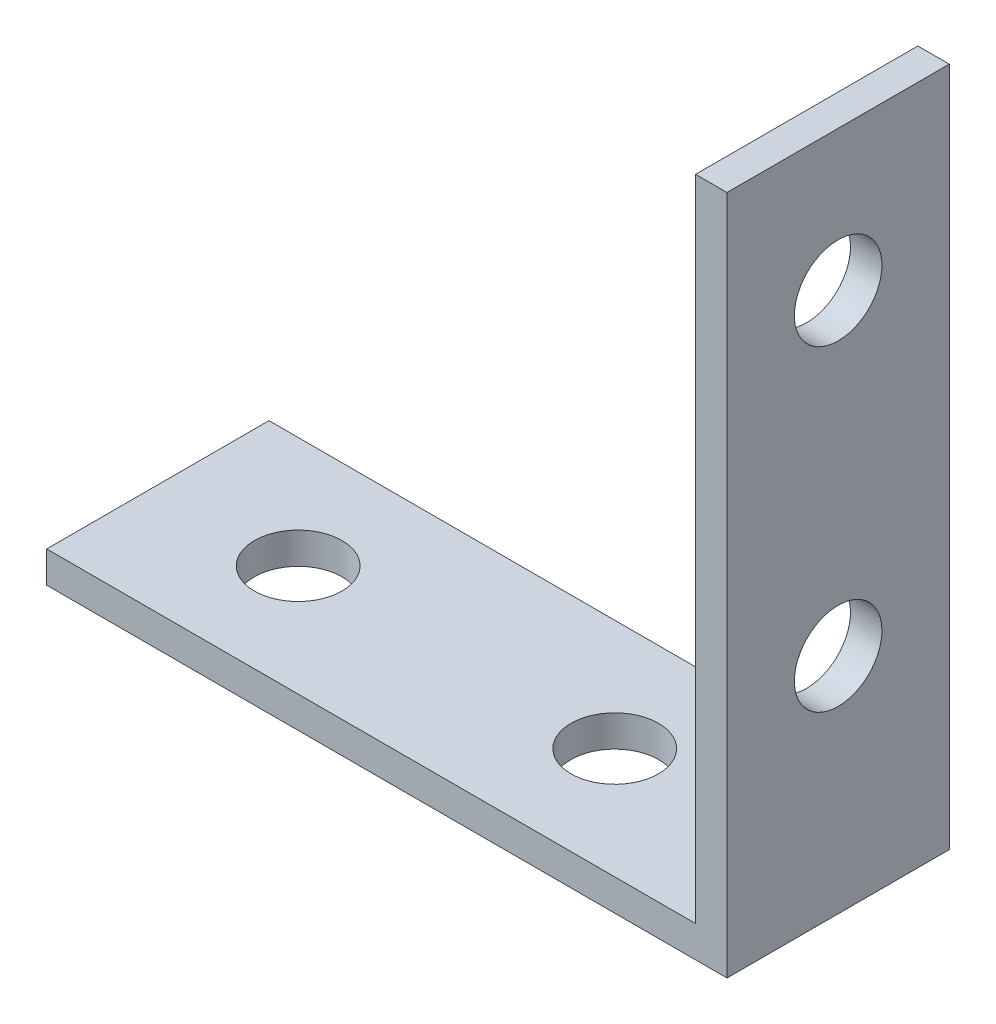
ISO-10303-21;
HEADER;
FILE_DESCRIPTION(('STEP AP214'),'2;1');
FILE_NAME('part.step','',(''),(''),'','','');
FILE_SCHEMA(('AUTOMOTIVE_DESIGN { 1 0 10303 214 1 1 1 1 }'));
ENDSEC;
DATA;
#1=APPLICATION_CONTEXT('core data for automotive mechanical design processes');
#2=APPLICATION_PROTOCOL_DEFINITION('international standard','automotive_design',2000,#1);
#3=PRODUCT_CONTEXT('',#1,'mechanical');
#4=PRODUCT('Part','Part','',(#3));
#5=PRODUCT_RELATED_PRODUCT_CATEGORY('part','',(#4));
#6=PRODUCT_DEFINITION_FORMATION('','',#4);
#7=PRODUCT_DEFINITION_CONTEXT('part definition',#1,'design');
#8=PRODUCT_DEFINITION('design','',#6,#7);
#9=PRODUCT_DEFINITION_SHAPE('','',#8);
#10=(LENGTH_UNIT() NAMED_UNIT(*) SI_UNIT(.MILLI.,.METRE.));
#11=(NAMED_UNIT(*) PLANE_ANGLE_UNIT() SI_UNIT($,.RADIAN.));
#12=(NAMED_UNIT(*) SI_UNIT($,.STERADIAN.) SOLID_ANGLE_UNIT());
#13=UNCERTAINTY_MEASURE_WITH_UNIT(LENGTH_MEASURE(1.E-05),#10,'distance_accuracy_value','');
#14=(GEOMETRIC_REPRESENTATION_CONTEXT(3) GLOBAL_UNCERTAINTY_ASSIGNED_CONTEXT((#13)) GLOBAL_UNIT_ASSIGNED_CONTEXT((#10,
#11,#12)) REPRESENTATION_CONTEXT('',''));
#15=CARTESIAN_POINT('',(0.,0.,0.));
#16=DIRECTION('',(0.,0.,1.));
#17=DIRECTION('',(1.,0.,0.));
#18=AXIS2_PLACEMENT_3D('',#15,#16,#17);
#19=CARTESIAN_POINT('',(0.,0.,12.573));
#20=DIRECTION('',(1.,0.,0.));
#21=DIRECTION('',(0.,0.,-1.));
#22=AXIS2_PLACEMENT_3D('',#19,#20,#21);
#23=PLANE('',#22);
#24=DIRECTION('',(0.,-1.,0.));
#25=VECTOR('',#24,1.);
#26=CARTESIAN_POINT('',(0.,0.,12.573));
#27=LINE('',#26,#25);
#28=CARTESIAN_POINT('',(0.,1.778,12.573));
#29=VERTEX_POINT('',#28);
#30=CARTESIAN_POINT('',(0.,0.,12.573));
#31=VERTEX_POINT('',#30);
#32=EDGE_CURVE('E77',#29,#31,#27,.T.);
#33=ORIENTED_EDGE('',*,*,#32,.F.);
#34=DIRECTION('',(0.,0.,1.));
#35=VECTOR('',#34,1.);
#36=CARTESIAN_POINT('',(0.,1.778,0.));
#37=LINE('',#36,#35);
#38=CARTESIAN_POINT('',(0.,1.778,0.));
#39=VERTEX_POINT('',#38);
#40=EDGE_CURVE('E97',#39,#29,#37,.T.);
#41=ORIENTED_EDGE('',*,*,#40,.F.);
#42=DIRECTION('',(0.,-1.,0.));
#43=VECTOR('',#42,1.);
#44=CARTESIAN_POINT('',(0.,0.,0.));
#45=LINE('',#44,#43);
#46=CARTESIAN_POINT('',(0.,0.,0.));
#47=VERTEX_POINT('',#46);
#48=EDGE_CURVE('E105',#39,#47,#45,.T.);
#49=ORIENTED_EDGE('',*,*,#48,.T.);
#50=DIRECTION('',(0.,0.,-1.));
#51=VECTOR('',#50,1.);
#52=CARTESIAN_POINT('',(0.,0.,12.573));
#53=LINE('',#52,#51);
#54=EDGE_CURVE('E11',#31,#47,#53,.T.);
#55=ORIENTED_EDGE('',*,*,#54,.F.);
#56=EDGE_LOOP('',(#33,#41,#49,#55));
#57=FACE_BOUND('',#56,.T.);
#58=ADVANCED_FACE('F32',(#57),#23,.F.);
#59=CARTESIAN_POINT('',(0.,0.,12.573));
#60=DIRECTION('',(0.,1.,0.));
#61=DIRECTION('',(0.,0.,1.));
#62=AXIS2_PLACEMENT_3D('',#59,#60,#61);
#63=PLANE('',#62);
#64=CARTESIAN_POINT('',(7.93750000000004,-7.42244807283576E-13,6.2865));
#65=DIRECTION('',(0.,-1.,0.));
#66=DIRECTION('',(1.,0.,0.));
#67=AXIS2_PLACEMENT_3D('',#64,#65,#66);
#68=CIRCLE('',#67,2.4765);
#69=CARTESIAN_POINT('',(10.414,-6.82227164254232E-13,6.2865));
#70=VERTEX_POINT('',#69);
#71=EDGE_CURVE('E157',#70,#70,#68,.T.);
#72=ORIENTED_EDGE('',*,*,#71,.F.);
#73=EDGE_LOOP('',(#72));
#74=FACE_BOUND('',#73,.T.);
#75=CARTESIAN_POINT('',(25.8445,-3.05094491337421E-13,6.2865));
#76=DIRECTION('',(0.,-1.,0.));
#77=DIRECTION('',(1.,0.,0.));
#78=AXIS2_PLACEMENT_3D('',#75,#76,#77);
#79=CIRCLE('',#78,2.4765);
#80=CARTESIAN_POINT('',(28.321,-2.45076848308077E-13,6.2865));
#81=VERTEX_POINT('',#80);
#82=EDGE_CURVE('E151',#81,#81,#79,.T.);
#83=ORIENTED_EDGE('',*,*,#82,.F.);
#84=EDGE_LOOP('',(#83));
#85=FACE_BOUND('',#84,.T.);
#86=DIRECTION('',(1.,0.,0.));
#87=VECTOR('',#86,1.);
#88=CARTESIAN_POINT('',(0.,0.,0.));
#89=LINE('',#88,#87);
#90=CARTESIAN_POINT('',(38.481,0.,0.));
#91=VERTEX_POINT('',#90);
#92=EDGE_CURVE('E109',#47,#91,#89,.T.);
#93=ORIENTED_EDGE('',*,*,#92,.T.);
#94=DIRECTION('',(0.,0.,-1.));
#95=VECTOR('',#94,1.);
#96=CARTESIAN_POINT('',(38.481,0.,12.573));
#97=LINE('',#96,#95);
#98=CARTESIAN_POINT('',(38.481,0.,12.573));
#99=VERTEX_POINT('',#98);
#100=EDGE_CURVE('E39',#99,#91,#97,.T.);
#101=ORIENTED_EDGE('',*,*,#100,.F.);
#102=DIRECTION('',(1.,0.,0.));
#103=VECTOR('',#102,1.);
#104=CARTESIAN_POINT('',(0.,0.,12.573));
#105=LINE('',#104,#103);
#106=EDGE_CURVE('E132',#31,#99,#105,.T.);
#107=ORIENTED_EDGE('',*,*,#106,.F.);
#108=ORIENTED_EDGE('',*,*,#54,.T.);
#109=EDGE_LOOP('',(#93,#101,#107,#108));
#110=FACE_BOUND('',#109,.T.);
#111=ADVANCED_FACE('F169',(#74,#85,#110),#63,.F.);
#112=CARTESIAN_POINT('',(38.481,0.,12.573));
#113=DIRECTION('',(-1.,0.,0.));
#114=DIRECTION('',(0.,0.,1.));
#115=AXIS2_PLACEMENT_3D('',#112,#113,#114);
#116=PLANE('',#115);
#117=CARTESIAN_POINT('',(38.481,30.5435,6.2865));
#118=DIRECTION('',(-1.,0.,0.));
#119=DIRECTION('',(0.,-1.,0.));
#120=AXIS2_PLACEMENT_3D('',#117,#118,#119);
#121=CIRCLE('',#120,2.4765);
#122=CARTESIAN_POINT('',(38.481,28.067,6.2865));
#123=VERTEX_POINT('',#122);
#124=EDGE_CURVE('E145',#123,#123,#121,.T.);
#125=ORIENTED_EDGE('',*,*,#124,.T.);
#126=EDGE_LOOP('',(#125));
#127=FACE_BOUND('',#126,.T.);
#128=CARTESIAN_POINT('',(38.481,12.6365,6.2865));
#129=DIRECTION('',(-1.,0.,0.));
#130=DIRECTION('',(0.,-1.,0.));
#131=AXIS2_PLACEMENT_3D('',#128,#129,#130);
#132=CIRCLE('',#131,2.4765);
#133=CARTESIAN_POINT('',(38.481,10.16,6.2865));
#134=VERTEX_POINT('',#133);
#135=EDGE_CURVE('E140',#134,#134,#132,.T.);
#136=ORIENTED_EDGE('',*,*,#135,.T.);
#137=EDGE_LOOP('',(#136));
#138=FACE_BOUND('',#137,.T.);
#139=DIRECTION('',(0.,1.,0.));
#140=VECTOR('',#139,1.);
#141=CARTESIAN_POINT('',(38.481,0.,0.));
#142=LINE('',#141,#140);
#143=CARTESIAN_POINT('',(38.481,38.481,0.));
#144=VERTEX_POINT('',#143);
#145=EDGE_CURVE('E72',#91,#144,#142,.T.);
#146=ORIENTED_EDGE('',*,*,#145,.T.);
#147=DIRECTION('',(0.,0.,-1.));
#148=VECTOR('',#147,1.);
#149=CARTESIAN_POINT('',(38.481,38.481,12.573));
#150=LINE('',#149,#148);
#151=CARTESIAN_POINT('',(38.481,38.481,12.573));
#152=VERTEX_POINT('',#151);
#153=EDGE_CURVE('E123',#152,#144,#150,.T.);
#154=ORIENTED_EDGE('',*,*,#153,.F.);
#155=DIRECTION('',(0.,1.,0.));
#156=VECTOR('',#155,1.);
#157=CARTESIAN_POINT('',(38.481,0.,12.573));
#158=LINE('',#157,#156);
#159=EDGE_CURVE('E55',#99,#152,#158,.T.);
#160=ORIENTED_EDGE('',*,*,#159,.F.);
#161=ORIENTED_EDGE('',*,*,#100,.T.);
#162=EDGE_LOOP('',(#146,#154,#160,#161));
#163=FACE_BOUND('',#162,.T.);
#164=ADVANCED_FACE('F125',(#127,#138,#163),#116,.F.);
#165=CARTESIAN_POINT('',(0.,38.481,12.573));
#166=DIRECTION('',(0.,-1.,0.));
#167=DIRECTION('',(0.,0.,-1.));
#168=AXIS2_PLACEMENT_3D('',#165,#166,#167);
#169=PLANE('',#168);
#170=DIRECTION('',(-1.,0.,0.));
#171=VECTOR('',#170,1.);
#172=CARTESIAN_POINT('',(0.,38.481,0.));
#173=LINE('',#172,#171);
#174=CARTESIAN_POINT('',(36.703,38.481,0.));
#175=VERTEX_POINT('',#174);
#176=EDGE_CURVE('E120',#144,#175,#173,.T.);
#177=ORIENTED_EDGE('',*,*,#176,.T.);
#178=DIRECTION('',(0.,0.,1.));
#179=VECTOR('',#178,1.);
#180=CARTESIAN_POINT('',(36.703,38.481,0.));
#181=LINE('',#180,#179);
#182=CARTESIAN_POINT('',(36.703,38.481,12.573));
#183=VERTEX_POINT('',#182);
#184=EDGE_CURVE('E110',#175,#183,#181,.T.);
#185=ORIENTED_EDGE('',*,*,#184,.T.);
#186=DIRECTION('',(-1.,0.,0.));
#187=VECTOR('',#186,1.);
#188=CARTESIAN_POINT('',(0.,38.481,12.573));
#189=LINE('',#188,#187);
#190=EDGE_CURVE('E116',#152,#183,#189,.T.);
#191=ORIENTED_EDGE('',*,*,#190,.F.);
#192=ORIENTED_EDGE('',*,*,#153,.T.);
#193=EDGE_LOOP('',(#177,#185,#191,#192));
#194=FACE_BOUND('',#193,.T.);
#195=ADVANCED_FACE('F129',(#194),#169,.F.);
#196=CARTESIAN_POINT('',(0.,0.,12.573));
#197=DIRECTION('',(0.,0.,-1.));
#198=DIRECTION('',(-1.,0.,0.));
#199=AXIS2_PLACEMENT_3D('',#196,#197,#198);
#200=PLANE('',#199);
#201=ORIENTED_EDGE('',*,*,#190,.T.);
#202=DIRECTION('',(0.,1.,0.));
#203=VECTOR('',#202,1.);
#204=CARTESIAN_POINT('',(36.703,38.481,12.573));
#205=LINE('',#204,#203);
#206=CARTESIAN_POINT('',(36.703,1.778,12.573));
#207=VERTEX_POINT('',#206);
#208=EDGE_CURVE('E101',#207,#183,#205,.T.);
#209=ORIENTED_EDGE('',*,*,#208,.F.);
#210=DIRECTION('',(1.,0.,0.));
#211=VECTOR('',#210,1.);
#212=CARTESIAN_POINT('',(0.,1.778,12.573));
#213=LINE('',#212,#211);
#214=EDGE_CURVE('E138',#29,#207,#213,.T.);
#215=ORIENTED_EDGE('',*,*,#214,.F.);
#216=ORIENTED_EDGE('',*,*,#32,.T.);
#217=ORIENTED_EDGE('',*,*,#106,.T.);
#218=ORIENTED_EDGE('',*,*,#159,.T.);
#219=EDGE_LOOP('',(#201,#209,#215,#216,#217,#218));
#220=FACE_BOUND('',#219,.T.);
#221=ADVANCED_FACE('F173',(#220),#200,.F.);
#222=CARTESIAN_POINT('',(0.,0.,0.));
#223=DIRECTION('',(0.,0.,-1.));
#224=DIRECTION('',(-1.,0.,0.));
#225=AXIS2_PLACEMENT_3D('',#222,#223,#224);
#226=PLANE('',#225);
#227=DIRECTION('',(0.,1.,0.));
#228=VECTOR('',#227,1.);
#229=CARTESIAN_POINT('',(36.703,38.481,0.));
#230=LINE('',#229,#228);
#231=CARTESIAN_POINT('',(36.703,1.778,0.));
#232=VERTEX_POINT('',#231);
#233=EDGE_CURVE('E46',#232,#175,#230,.T.);
#234=ORIENTED_EDGE('',*,*,#233,.T.);
#235=ORIENTED_EDGE('',*,*,#176,.F.);
#236=ORIENTED_EDGE('',*,*,#145,.F.);
#237=ORIENTED_EDGE('',*,*,#92,.F.);
#238=ORIENTED_EDGE('',*,*,#48,.F.);
#239=DIRECTION('',(1.,0.,0.));
#240=VECTOR('',#239,1.);
#241=CARTESIAN_POINT('',(0.,1.778,0.));
#242=LINE('',#241,#240);
#243=EDGE_CURVE('E93',#39,#232,#242,.T.);
#244=ORIENTED_EDGE('',*,*,#243,.T.);
#245=EDGE_LOOP('',(#234,#235,#236,#237,#238,#244));
#246=FACE_BOUND('',#245,.T.);
#247=ADVANCED_FACE('F108',(#246),#226,.T.);
#248=CARTESIAN_POINT('',(36.703,38.481,0.));
#249=DIRECTION('',(1.,0.,0.));
#250=DIRECTION('',(0.,1.,0.));
#251=AXIS2_PLACEMENT_3D('',#248,#249,#250);
#252=PLANE('',#251);
#253=CARTESIAN_POINT('',(36.703,30.5435,6.2865));
#254=DIRECTION('',(-1.,0.,0.));
#255=DIRECTION('',(0.,-1.,0.));
#256=AXIS2_PLACEMENT_3D('',#253,#254,#255);
#257=CIRCLE('',#256,2.4765);
#258=CARTESIAN_POINT('',(36.703,28.067,6.2865));
#259=VERTEX_POINT('',#258);
#260=EDGE_CURVE('E148',#259,#259,#257,.T.);
#261=ORIENTED_EDGE('',*,*,#260,.F.);
#262=EDGE_LOOP('',(#261));
#263=FACE_BOUND('',#262,.T.);
#264=CARTESIAN_POINT('',(36.703,12.6365,6.2865));
#265=DIRECTION('',(-1.,0.,0.));
#266=DIRECTION('',(0.,-1.,0.));
#267=AXIS2_PLACEMENT_3D('',#264,#265,#266);
#268=CIRCLE('',#267,2.4765);
#269=CARTESIAN_POINT('',(36.703,10.16,6.2865));
#270=VERTEX_POINT('',#269);
#271=EDGE_CURVE('E142',#270,#270,#268,.T.);
#272=ORIENTED_EDGE('',*,*,#271,.F.);
#273=EDGE_LOOP('',(#272));
#274=FACE_BOUND('',#273,.T.);
#275=ORIENTED_EDGE('',*,*,#208,.T.);
#276=ORIENTED_EDGE('',*,*,#184,.F.);
#277=ORIENTED_EDGE('',*,*,#233,.F.);
#278=DIRECTION('',(0.,0.,1.));
#279=VECTOR('',#278,1.);
#280=CARTESIAN_POINT('',(36.703,1.778,0.));
#281=LINE('',#280,#279);
#282=EDGE_CURVE('E98',#232,#207,#281,.T.);
#283=ORIENTED_EDGE('',*,*,#282,.T.);
#284=EDGE_LOOP('',(#275,#276,#277,#283));
#285=FACE_BOUND('',#284,.T.);
#286=ADVANCED_FACE('F180',(#263,#274,#285),#252,.F.);
#287=CARTESIAN_POINT('',(0.,1.778,0.));
#288=DIRECTION('',(0.,-1.,0.));
#289=DIRECTION('',(0.,0.,-1.));
#290=AXIS2_PLACEMENT_3D('',#287,#288,#289);
#291=PLANE('',#290);
#292=CARTESIAN_POINT('',(7.93749999999999,1.7779999999993,6.2865));
#293=DIRECTION('',(0.,-1.,0.));
#294=DIRECTION('',(1.,0.,0.));
#295=AXIS2_PLACEMENT_3D('',#292,#293,#294);
#296=CIRCLE('',#295,2.4765);
#297=CARTESIAN_POINT('',(10.414,1.77799999999936,6.2865));
#298=VERTEX_POINT('',#297);
#299=EDGE_CURVE('E160',#298,#298,#296,.T.);
#300=ORIENTED_EDGE('',*,*,#299,.T.);
#301=EDGE_LOOP('',(#300));
#302=FACE_BOUND('',#301,.T.);
#303=CARTESIAN_POINT('',(25.8445,1.77799999999974,6.2865));
#304=DIRECTION('',(0.,-1.,0.));
#305=DIRECTION('',(1.,0.,0.));
#306=AXIS2_PLACEMENT_3D('',#303,#304,#305);
#307=CIRCLE('',#306,2.4765);
#308=CARTESIAN_POINT('',(28.321,1.7779999999998,6.2865));
#309=VERTEX_POINT('',#308);
#310=EDGE_CURVE('E154',#309,#309,#307,.T.);
#311=ORIENTED_EDGE('',*,*,#310,.T.);
#312=EDGE_LOOP('',(#311));
#313=FACE_BOUND('',#312,.T.);
#314=ORIENTED_EDGE('',*,*,#214,.T.);
#315=ORIENTED_EDGE('',*,*,#282,.F.);
#316=ORIENTED_EDGE('',*,*,#243,.F.);
#317=ORIENTED_EDGE('',*,*,#40,.T.);
#318=EDGE_LOOP('',(#314,#315,#316,#317));
#319=FACE_BOUND('',#318,.T.);
#320=ADVANCED_FACE('F96',(#302,#313,#319),#291,.F.);
#321=CARTESIAN_POINT('',(38.481,12.6365,6.2865));
#322=DIRECTION('',(-1.,0.,0.));
#323=DIRECTION('',(0.,-1.,0.));
#324=AXIS2_PLACEMENT_3D('',#321,#322,#323);
#325=CYLINDRICAL_SURFACE('',#324,2.4765);
#326=ORIENTED_EDGE('',*,*,#135,.F.);
#327=EDGE_LOOP('',(#326));
#328=FACE_BOUND('',#327,.T.);
#329=ORIENTED_EDGE('',*,*,#271,.T.);
#330=EDGE_LOOP('',(#329));
#331=FACE_BOUND('',#330,.T.);
#332=ADVANCED_FACE('F229',(#328,#331),#325,.F.);
#333=CARTESIAN_POINT('',(38.481,30.5435,6.2865));
#334=DIRECTION('',(-1.,0.,0.));
#335=DIRECTION('',(0.,-1.,0.));
#336=AXIS2_PLACEMENT_3D('',#333,#334,#335);
#337=CYLINDRICAL_SURFACE('',#336,2.4765);
#338=ORIENTED_EDGE('',*,*,#124,.F.);
#339=EDGE_LOOP('',(#338));
#340=FACE_BOUND('',#339,.T.);
#341=ORIENTED_EDGE('',*,*,#260,.T.);
#342=EDGE_LOOP('',(#341));
#343=FACE_BOUND('',#342,.T.);
#344=ADVANCED_FACE('F236',(#340,#343),#337,.F.);
#345=CARTESIAN_POINT('',(25.8445,-3.05094491337421E-13,6.2865));
#346=DIRECTION('',(0.,1.,0.));
#347=DIRECTION('',(-1.,0.,0.));
#348=AXIS2_PLACEMENT_3D('',#345,#346,#347);
#349=CYLINDRICAL_SURFACE('',#348,2.4765);
#350=ORIENTED_EDGE('',*,*,#82,.T.);
#351=EDGE_LOOP('',(#350));
#352=FACE_BOUND('',#351,.T.);
#353=ORIENTED_EDGE('',*,*,#310,.F.);
#354=EDGE_LOOP('',(#353));
#355=FACE_BOUND('',#354,.T.);
#356=ADVANCED_FACE('F243',(#352,#355),#349,.F.);
#357=CARTESIAN_POINT('',(7.93750000000004,-7.42244807283576E-13,6.2865));
#358=DIRECTION('',(0.,1.,0.));
#359=DIRECTION('',(-1.,0.,0.));
#360=AXIS2_PLACEMENT_3D('',#357,#358,#359);
#361=CYLINDRICAL_SURFACE('',#360,2.4765);
#362=ORIENTED_EDGE('',*,*,#71,.T.);
#363=EDGE_LOOP('',(#362));
#364=FACE_BOUND('',#363,.T.);
#365=ORIENTED_EDGE('',*,*,#299,.F.);
#366=EDGE_LOOP('',(#365));
#367=FACE_BOUND('',#366,.T.);
#368=ADVANCED_FACE('F166',(#364,#367),#361,.F.);
#369=CLOSED_SHELL('',(#58,#111,#164,#195,#221,#247,#286,#320,#332,#344,#356,#368));
#370=MANIFOLD_SOLID_BREP('B2',#369);
#371=ADVANCED_BREP_SHAPE_REPRESENTATION('',(#18,#370),#14);
#372=SHAPE_DEFINITION_REPRESENTATION(#9,#371);
ENDSEC;
END-ISO-10303-21;
